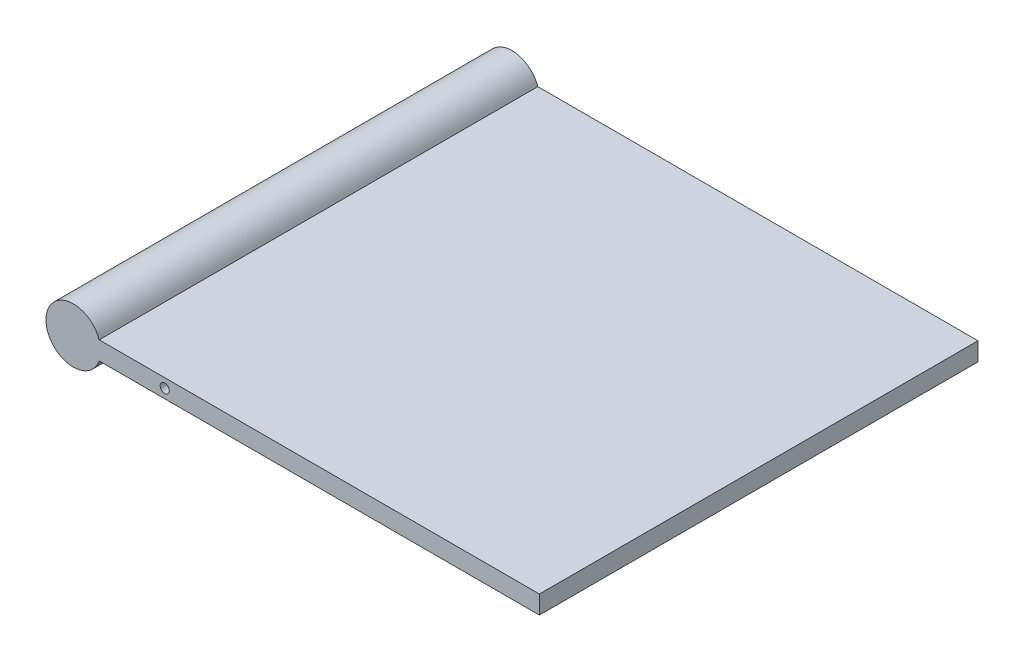
ISO-10303-21;
HEADER;
FILE_DESCRIPTION(('STEP AP214'),'2;1');
FILE_NAME('part.step','',(''),(''),'','','');
FILE_SCHEMA(('AUTOMOTIVE_DESIGN { 1 0 10303 214 1 1 1 1 }'));
ENDSEC;
DATA;
#1=APPLICATION_CONTEXT('core data for automotive mechanical design processes');
#2=APPLICATION_PROTOCOL_DEFINITION('international standard','automotive_design',2000,#1);
#3=PRODUCT_CONTEXT('',#1,'mechanical');
#4=PRODUCT('Part','Part','',(#3));
#5=PRODUCT_RELATED_PRODUCT_CATEGORY('part','',(#4));
#6=PRODUCT_DEFINITION_FORMATION('','',#4);
#7=PRODUCT_DEFINITION_CONTEXT('part definition',#1,'design');
#8=PRODUCT_DEFINITION('design','',#6,#7);
#9=PRODUCT_DEFINITION_SHAPE('','',#8);
#10=(LENGTH_UNIT() NAMED_UNIT(*) SI_UNIT(.MILLI.,.METRE.));
#11=(NAMED_UNIT(*) PLANE_ANGLE_UNIT() SI_UNIT($,.RADIAN.));
#12=(NAMED_UNIT(*) SI_UNIT($,.STERADIAN.) SOLID_ANGLE_UNIT());
#13=UNCERTAINTY_MEASURE_WITH_UNIT(LENGTH_MEASURE(1.E-05),#10,'distance_accuracy_value','');
#14=(GEOMETRIC_REPRESENTATION_CONTEXT(3) GLOBAL_UNCERTAINTY_ASSIGNED_CONTEXT((#13)) GLOBAL_UNIT_ASSIGNED_CONTEXT((#10,
#11,#12)) REPRESENTATION_CONTEXT('',''));
#15=CARTESIAN_POINT('',(0.,0.,0.));
#16=DIRECTION('',(0.,0.,1.));
#17=DIRECTION('',(1.,0.,0.));
#18=AXIS2_PLACEMENT_3D('',#15,#16,#17);
#19=CARTESIAN_POINT('',(323.85,6.35,152.4));
#20=DIRECTION('',(0.,-1.,0.));
#21=DIRECTION('',(1.,0.,0.));
#22=AXIS2_PLACEMENT_3D('',#19,#20,#21);
#23=PLANE('',#22);
#24=DIRECTION('',(-1.,0.,0.));
#25=VECTOR('',#24,1.);
#26=CARTESIAN_POINT('',(323.85,6.35,-152.4));
#27=LINE('',#26,#25);
#28=CARTESIAN_POINT('',(323.85,6.35,-152.4));
#29=VERTEX_POINT('',#28);
#30=CARTESIAN_POINT('',(17.9605122421383,6.34999999999996,-152.4));
#31=VERTEX_POINT('',#30);
#32=EDGE_CURVE('E71',#29,#31,#27,.T.);
#33=ORIENTED_EDGE('',*,*,#32,.T.);
#34=DIRECTION('',(0.,0.,-1.));
#35=VECTOR('',#34,1.);
#36=CARTESIAN_POINT('',(17.9605122421383,6.34999999999996,152.4));
#37=LINE('',#36,#35);
#38=CARTESIAN_POINT('',(17.9605122421383,6.34999999999996,152.4));
#39=VERTEX_POINT('',#38);
#40=EDGE_CURVE('E11',#39,#31,#37,.T.);
#41=ORIENTED_EDGE('',*,*,#40,.F.);
#42=DIRECTION('',(-1.,0.,0.));
#43=VECTOR('',#42,1.);
#44=CARTESIAN_POINT('',(323.85,6.35,152.4));
#45=LINE('',#44,#43);
#46=CARTESIAN_POINT('',(323.85,6.35,152.4));
#47=VERTEX_POINT('',#46);
#48=EDGE_CURVE('E94',#47,#39,#45,.T.);
#49=ORIENTED_EDGE('',*,*,#48,.F.);
#50=DIRECTION('',(0.,0.,-1.));
#51=VECTOR('',#50,1.);
#52=CARTESIAN_POINT('',(323.85,6.35,152.4));
#53=LINE('',#52,#51);
#54=EDGE_CURVE('E83',#47,#29,#53,.T.);
#55=ORIENTED_EDGE('',*,*,#54,.T.);
#56=EDGE_LOOP('',(#33,#41,#49,#55));
#57=FACE_BOUND('',#56,.T.);
#58=ADVANCED_FACE('F27',(#57),#23,.F.);
#59=CARTESIAN_POINT('',(0.,0.,152.4));
#60=DIRECTION('',(0.,0.,-1.));
#61=DIRECTION('',(-1.,0.,0.));
#62=AXIS2_PLACEMENT_3D('',#59,#60,#61);
#63=CYLINDRICAL_SURFACE('',#62,19.05);
#64=CARTESIAN_POINT('',(0.,0.,-152.4));
#65=DIRECTION('',(0.,0.,1.));
#66=DIRECTION('',(1.,0.,0.));
#67=AXIS2_PLACEMENT_3D('',#64,#65,#66);
#68=CIRCLE('',#67,19.05);
#69=CARTESIAN_POINT('',(17.9605122421383,-6.34999999999996,-152.4));
#70=VERTEX_POINT('',#69);
#71=EDGE_CURVE('E67',#31,#70,#68,.T.);
#72=ORIENTED_EDGE('',*,*,#71,.T.);
#73=DIRECTION('',(0.,0.,-1.));
#74=VECTOR('',#73,1.);
#75=CARTESIAN_POINT('',(17.9605122421383,-6.34999999999996,152.4));
#76=LINE('',#75,#74);
#77=CARTESIAN_POINT('',(17.9605122421383,-6.34999999999996,152.4));
#78=VERTEX_POINT('',#77);
#79=EDGE_CURVE('E34',#78,#70,#76,.T.);
#80=ORIENTED_EDGE('',*,*,#79,.F.);
#81=CARTESIAN_POINT('',(0.,0.,152.4));
#82=DIRECTION('',(0.,0.,1.));
#83=DIRECTION('',(1.,0.,0.));
#84=AXIS2_PLACEMENT_3D('',#81,#82,#83);
#85=CIRCLE('',#84,19.05);
#86=EDGE_CURVE('E79',#39,#78,#85,.T.);
#87=ORIENTED_EDGE('',*,*,#86,.F.);
#88=ORIENTED_EDGE('',*,*,#40,.T.);
#89=EDGE_LOOP('',(#72,#80,#87,#88));
#90=FACE_BOUND('',#89,.T.);
#91=ADVANCED_FACE('F78',(#90),#63,.T.);
#92=CARTESIAN_POINT('',(323.85,-6.35,152.4));
#93=DIRECTION('',(0.,1.,0.));
#94=DIRECTION('',(-1.,0.,0.));
#95=AXIS2_PLACEMENT_3D('',#92,#93,#94);
#96=PLANE('',#95);
#97=DIRECTION('',(1.,0.,0.));
#98=VECTOR('',#97,1.);
#99=CARTESIAN_POINT('',(323.85,-6.35,-152.4));
#100=LINE('',#99,#98);
#101=CARTESIAN_POINT('',(323.85,-6.35,-152.4));
#102=VERTEX_POINT('',#101);
#103=EDGE_CURVE('E72',#70,#102,#100,.T.);
#104=ORIENTED_EDGE('',*,*,#103,.T.);
#105=DIRECTION('',(0.,0.,-1.));
#106=VECTOR('',#105,1.);
#107=CARTESIAN_POINT('',(323.85,-6.35,152.4));
#108=LINE('',#107,#106);
#109=CARTESIAN_POINT('',(323.85,-6.35,152.4));
#110=VERTEX_POINT('',#109);
#111=EDGE_CURVE('E100',#110,#102,#108,.T.);
#112=ORIENTED_EDGE('',*,*,#111,.F.);
#113=DIRECTION('',(1.,0.,0.));
#114=VECTOR('',#113,1.);
#115=CARTESIAN_POINT('',(323.85,-6.35,152.4));
#116=LINE('',#115,#114);
#117=EDGE_CURVE('E46',#78,#110,#116,.T.);
#118=ORIENTED_EDGE('',*,*,#117,.F.);
#119=ORIENTED_EDGE('',*,*,#79,.T.);
#120=EDGE_LOOP('',(#104,#112,#118,#119));
#121=FACE_BOUND('',#120,.T.);
#122=ADVANCED_FACE('F103',(#121),#96,.F.);
#123=CARTESIAN_POINT('',(323.85,6.35,152.4));
#124=DIRECTION('',(-1.,0.,0.));
#125=DIRECTION('',(0.,0.,1.));
#126=AXIS2_PLACEMENT_3D('',#123,#124,#125);
#127=PLANE('',#126);
#128=DIRECTION('',(0.,1.,0.));
#129=VECTOR('',#128,1.);
#130=CARTESIAN_POINT('',(323.85,6.35,-152.4));
#131=LINE('',#130,#129);
#132=EDGE_CURVE('E92',#102,#29,#131,.T.);
#133=ORIENTED_EDGE('',*,*,#132,.T.);
#134=ORIENTED_EDGE('',*,*,#54,.F.);
#135=DIRECTION('',(0.,1.,0.));
#136=VECTOR('',#135,1.);
#137=CARTESIAN_POINT('',(323.85,6.35,152.4));
#138=LINE('',#137,#136);
#139=EDGE_CURVE('E41',#110,#47,#138,.T.);
#140=ORIENTED_EDGE('',*,*,#139,.F.);
#141=ORIENTED_EDGE('',*,*,#111,.T.);
#142=EDGE_LOOP('',(#133,#134,#140,#141));
#143=FACE_BOUND('',#142,.T.);
#144=ADVANCED_FACE('F105',(#143),#127,.F.);
#145=CARTESIAN_POINT('',(0.,0.,152.4));
#146=DIRECTION('',(0.,0.,1.));
#147=DIRECTION('',(1.,0.,0.));
#148=AXIS2_PLACEMENT_3D('',#145,#146,#147);
#149=PLANE('',#148);
#150=CARTESIAN_POINT('',(63.5,0.,152.4));
#151=DIRECTION('',(0.,0.,1.));
#152=DIRECTION('',(1.,0.,0.));
#153=AXIS2_PLACEMENT_3D('',#150,#151,#152);
#154=CIRCLE('',#153,3.17499999999997);
#155=CARTESIAN_POINT('',(66.675,0.,152.4));
#156=VERTEX_POINT('',#155);
#157=EDGE_CURVE('E87',#156,#156,#154,.T.);
#158=ORIENTED_EDGE('',*,*,#157,.F.);
#159=EDGE_LOOP('',(#158));
#160=FACE_BOUND('',#159,.T.);
#161=ORIENTED_EDGE('',*,*,#48,.T.);
#162=ORIENTED_EDGE('',*,*,#86,.T.);
#163=ORIENTED_EDGE('',*,*,#117,.T.);
#164=ORIENTED_EDGE('',*,*,#139,.T.);
#165=EDGE_LOOP('',(#161,#162,#163,#164));
#166=FACE_BOUND('',#165,.T.);
#167=ADVANCED_FACE('F106',(#160,#166),#149,.T.);
#168=CARTESIAN_POINT('',(0.,0.,-152.4));
#169=DIRECTION('',(0.,0.,1.));
#170=DIRECTION('',(1.,0.,0.));
#171=AXIS2_PLACEMENT_3D('',#168,#169,#170);
#172=PLANE('',#171);
#173=CARTESIAN_POINT('',(63.5,0.,-152.4));
#174=DIRECTION('',(0.,0.,1.));
#175=DIRECTION('',(1.,0.,0.));
#176=AXIS2_PLACEMENT_3D('',#173,#174,#175);
#177=CIRCLE('',#176,3.17499999999997);
#178=CARTESIAN_POINT('',(66.675,0.,-152.4));
#179=VERTEX_POINT('',#178);
#180=EDGE_CURVE('E84',#179,#179,#177,.T.);
#181=ORIENTED_EDGE('',*,*,#180,.T.);
#182=EDGE_LOOP('',(#181));
#183=FACE_BOUND('',#182,.T.);
#184=ORIENTED_EDGE('',*,*,#32,.F.);
#185=ORIENTED_EDGE('',*,*,#132,.F.);
#186=ORIENTED_EDGE('',*,*,#103,.F.);
#187=ORIENTED_EDGE('',*,*,#71,.F.);
#188=EDGE_LOOP('',(#184,#185,#186,#187));
#189=FACE_BOUND('',#188,.T.);
#190=ADVANCED_FACE('F68',(#183,#189),#172,.F.);
#191=CARTESIAN_POINT('',(63.5,0.,-152.4));
#192=DIRECTION('',(0.,0.,1.));
#193=DIRECTION('',(1.,0.,0.));
#194=AXIS2_PLACEMENT_3D('',#191,#192,#193);
#195=CYLINDRICAL_SURFACE('',#194,3.17499999999997);
#196=CARTESIAN_POINT('',(66.675,0.,-152.4));
#197=CARTESIAN_POINT('',(66.675,0.,-149.225));
#198=CARTESIAN_POINT('',(66.675,0.,-146.05));
#199=CARTESIAN_POINT('',(66.675,0.,-139.7));
#200=CARTESIAN_POINT('',(66.675,0.,-136.525));
#201=CARTESIAN_POINT('',(66.675,0.,-130.175));
#202=CARTESIAN_POINT('',(66.675,0.,-127.));
#203=CARTESIAN_POINT('',(66.675,0.,-120.65));
#204=CARTESIAN_POINT('',(66.675,0.,-117.475));
#205=CARTESIAN_POINT('',(66.675,0.,-111.125));
#206=CARTESIAN_POINT('',(66.675,0.,-107.95));
#207=CARTESIAN_POINT('',(66.675,0.,-101.6));
#208=CARTESIAN_POINT('',(66.675,0.,-98.425));
#209=CARTESIAN_POINT('',(66.675,0.,-92.075));
#210=CARTESIAN_POINT('',(66.675,0.,-88.9));
#211=CARTESIAN_POINT('',(66.675,0.,-82.55));
#212=CARTESIAN_POINT('',(66.675,0.,-79.375));
#213=CARTESIAN_POINT('',(66.675,0.,-73.025));
#214=CARTESIAN_POINT('',(66.675,0.,-69.85));
#215=CARTESIAN_POINT('',(66.675,0.,-63.5));
#216=CARTESIAN_POINT('',(66.675,0.,-60.325));
#217=CARTESIAN_POINT('',(66.675,0.,-53.975));
#218=CARTESIAN_POINT('',(66.675,0.,-50.8));
#219=CARTESIAN_POINT('',(66.675,0.,-44.45));
#220=CARTESIAN_POINT('',(66.675,0.,-41.275));
#221=CARTESIAN_POINT('',(66.675,0.,-34.925));
#222=CARTESIAN_POINT('',(66.675,0.,-31.75));
#223=CARTESIAN_POINT('',(66.675,0.,-25.4));
#224=CARTESIAN_POINT('',(66.675,0.,-22.225));
#225=CARTESIAN_POINT('',(66.675,0.,-15.875));
#226=CARTESIAN_POINT('',(66.675,0.,-12.7));
#227=CARTESIAN_POINT('',(66.675,0.,-6.35));
#228=CARTESIAN_POINT('',(66.675,0.,-3.175));
#229=CARTESIAN_POINT('',(66.675,0.,3.175));
#230=CARTESIAN_POINT('',(66.675,0.,6.35));
#231=CARTESIAN_POINT('',(66.675,0.,12.7));
#232=CARTESIAN_POINT('',(66.675,0.,15.875));
#233=CARTESIAN_POINT('',(66.675,0.,22.225));
#234=CARTESIAN_POINT('',(66.675,0.,25.4));
#235=CARTESIAN_POINT('',(66.675,0.,31.75));
#236=CARTESIAN_POINT('',(66.675,0.,34.925));
#237=CARTESIAN_POINT('',(66.675,0.,41.275));
#238=CARTESIAN_POINT('',(66.675,0.,44.45));
#239=CARTESIAN_POINT('',(66.675,0.,50.8));
#240=CARTESIAN_POINT('',(66.675,0.,53.975));
#241=CARTESIAN_POINT('',(66.675,0.,60.325));
#242=CARTESIAN_POINT('',(66.675,0.,63.5));
#243=CARTESIAN_POINT('',(66.675,0.,69.85));
#244=CARTESIAN_POINT('',(66.675,0.,73.025));
#245=CARTESIAN_POINT('',(66.675,0.,79.375));
#246=CARTESIAN_POINT('',(66.675,0.,82.55));
#247=CARTESIAN_POINT('',(66.675,0.,88.9));
#248=CARTESIAN_POINT('',(66.675,0.,92.075));
#249=CARTESIAN_POINT('',(66.675,0.,98.425));
#250=CARTESIAN_POINT('',(66.675,0.,101.6));
#251=CARTESIAN_POINT('',(66.675,0.,107.95));
#252=CARTESIAN_POINT('',(66.675,0.,111.125));
#253=CARTESIAN_POINT('',(66.675,0.,117.475));
#254=CARTESIAN_POINT('',(66.675,0.,120.65));
#255=CARTESIAN_POINT('',(66.675,0.,127.));
#256=CARTESIAN_POINT('',(66.675,0.,130.175));
#257=CARTESIAN_POINT('',(66.675,0.,136.525));
#258=CARTESIAN_POINT('',(66.675,0.,139.7));
#259=CARTESIAN_POINT('',(66.675,0.,146.05));
#260=CARTESIAN_POINT('',(66.675,0.,149.225));
#261=CARTESIAN_POINT('',(66.675,0.,152.4));
#262=B_SPLINE_CURVE_WITH_KNOTS('',3,(#196,#197,#198,#199,#200,#201,#202,#203,#204,#205,#206,
#207,#208,#209,#210,#211,#212,#213,#214,#215,#216,#217,#218,#219,#220,#221,#222,#223,#224,#225,
#226,#227,#228,#229,#230,#231,#232,#233,#234,#235,#236,#237,#238,#239,#240,#241,#242,#243,#244,
#245,#246,#247,#248,#249,#250,#251,#252,#253,#254,#255,#256,#257,#258,#259,#260,#261),
.UNSPECIFIED.,.F.,.F.,(4,2,2,2,2,2,2,2,2,2,2,2,2,2,2,2,2,2,2,2,2,2,2,2,2,2,2,2,2,2,2,2,4),(0.,
9.52499999999998,19.05,28.575,38.1,47.625,57.15,66.675,76.2,85.725,95.25,104.775,114.3,123.825,
133.35,142.875,152.4,161.925,171.45,180.975,190.5,200.025,209.55,219.075,228.6,238.125,247.65,
257.175,266.7,276.225,285.75,295.275,304.8),.UNSPECIFIED.);
#263=EDGE_CURVE('BSEAM114',#179,#156,#262,.T.);
#264=ORIENTED_EDGE('',*,*,#180,.F.);
#265=ORIENTED_EDGE('',*,*,#157,.T.);
#266=ORIENTED_EDGE('',*,*,#263,.T.);
#267=ORIENTED_EDGE('',*,*,#263,.F.);
#268=EDGE_LOOP('',(#264,#266,#265,#267));
#269=FACE_BOUND('',#268,.T.);
#270=ADVANCED_FACE('F114',(#269),#195,.F.);
#271=CLOSED_SHELL('',(#58,#91,#122,#144,#167,#190,#270));
#272=MANIFOLD_SOLID_BREP('B2',#271);
#273=ADVANCED_BREP_SHAPE_REPRESENTATION('',(#18,#272),#14);
#274=SHAPE_DEFINITION_REPRESENTATION(#9,#273);
ENDSEC;
END-ISO-10303-21;
